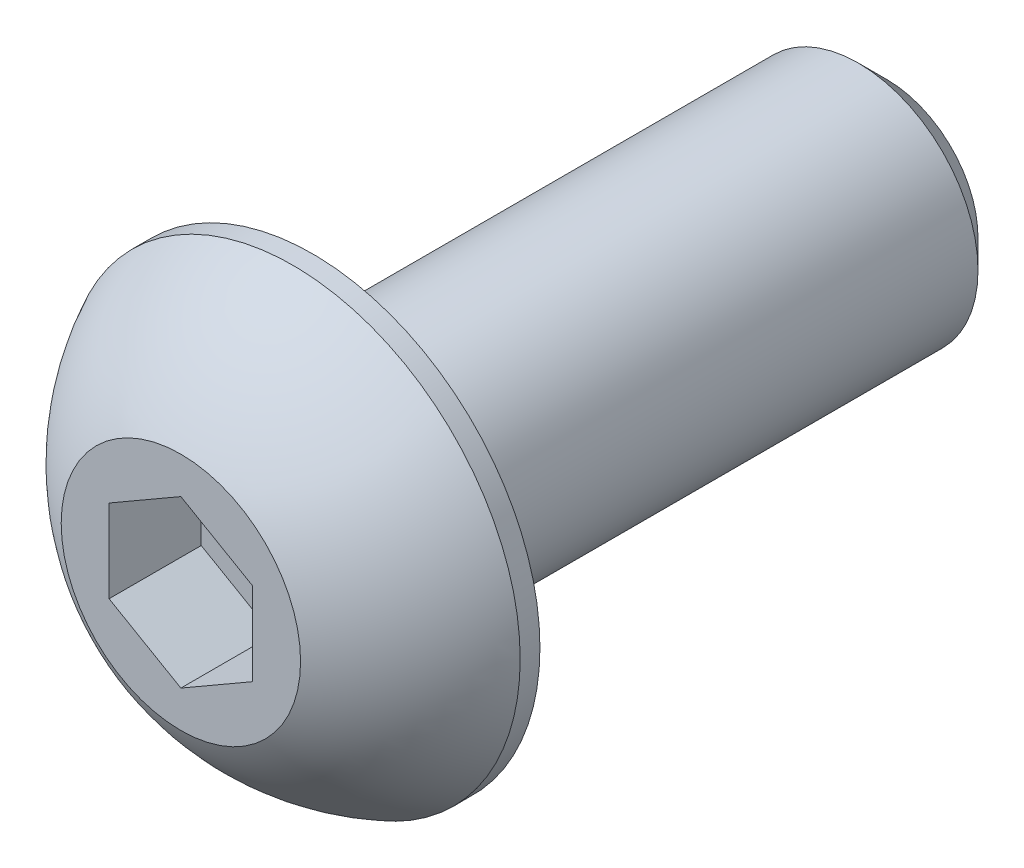
ISO-10303-21;
HEADER;
FILE_DESCRIPTION(('STEP AP214'),'2;1');
FILE_NAME('part.step','',(''),(''),'','','');
FILE_SCHEMA(('AUTOMOTIVE_DESIGN { 1 0 10303 214 1 1 1 1 }'));
ENDSEC;
DATA;
#1=APPLICATION_CONTEXT('core data for automotive mechanical design processes');
#2=APPLICATION_PROTOCOL_DEFINITION('international standard','automotive_design',2000,#1);
#3=PRODUCT_CONTEXT('',#1,'mechanical');
#4=PRODUCT('Part','Part','',(#3));
#5=PRODUCT_RELATED_PRODUCT_CATEGORY('part','',(#4));
#6=PRODUCT_DEFINITION_FORMATION('','',#4);
#7=PRODUCT_DEFINITION_CONTEXT('part definition',#1,'design');
#8=PRODUCT_DEFINITION('design','',#6,#7);
#9=PRODUCT_DEFINITION_SHAPE('','',#8);
#10=(LENGTH_UNIT() NAMED_UNIT(*) SI_UNIT(.MILLI.,.METRE.));
#11=(NAMED_UNIT(*) PLANE_ANGLE_UNIT() SI_UNIT($,.RADIAN.));
#12=(NAMED_UNIT(*) SI_UNIT($,.STERADIAN.) SOLID_ANGLE_UNIT());
#13=UNCERTAINTY_MEASURE_WITH_UNIT(LENGTH_MEASURE(1.E-05),#10,'distance_accuracy_value','');
#14=(GEOMETRIC_REPRESENTATION_CONTEXT(3) GLOBAL_UNCERTAINTY_ASSIGNED_CONTEXT((#13)) GLOBAL_UNIT_ASSIGNED_CONTEXT((#10,
#11,#12)) REPRESENTATION_CONTEXT('',''));
#15=CARTESIAN_POINT('',(0.,0.,0.));
#16=DIRECTION('',(0.,0.,1.));
#17=DIRECTION('',(1.,0.,0.));
#18=AXIS2_PLACEMENT_3D('',#15,#16,#17);
#19=CARTESIAN_POINT('',(0.,-2.5,-14.75));
#20=DIRECTION('',(0.,0.,-1.));
#21=DIRECTION('',(0.,1.,0.));
#22=AXIS2_PLACEMENT_3D('',#19,#20,#21);
#23=PLANE('',#22);
#24=CARTESIAN_POINT('',(0.,0.,-14.75));
#25=DIRECTION('',(0.,0.,-1.));
#26=DIRECTION('',(0.,1.,0.));
#27=AXIS2_PLACEMENT_3D('',#24,#25,#26);
#28=CIRCLE('',#27,1.9);
#29=CARTESIAN_POINT('',(0.,1.9,-14.75));
#30=VERTEX_POINT('',#29);
#31=EDGE_CURVE('E50',#30,#30,#28,.T.);
#32=ORIENTED_EDGE('',*,*,#31,.T.);
#33=EDGE_LOOP('',(#32));
#34=FACE_BOUND('',#33,.T.);
#35=ADVANCED_FACE('F41',(#34),#23,.T.);
#36=CARTESIAN_POINT('',(0.,0.,-14.75));
#37=DIRECTION('',(0.,0.,-1.));
#38=DIRECTION('',(0.,1.,0.));
#39=AXIS2_PLACEMENT_3D('',#36,#37,#38);
#40=CYLINDRICAL_SURFACE('',#39,2.5);
#41=CARTESIAN_POINT('',(0.,0.,-14.15));
#42=DIRECTION('',(0.,0.,-1.));
#43=DIRECTION('',(0.,1.,0.));
#44=AXIS2_PLACEMENT_3D('',#41,#42,#43);
#45=CIRCLE('',#44,2.5);
#46=CARTESIAN_POINT('',(0.,2.5,-14.15));
#47=VERTEX_POINT('',#46);
#48=EDGE_CURVE('E11',#47,#47,#45,.F.);
#49=ORIENTED_EDGE('',*,*,#48,.T.);
#50=EDGE_LOOP('',(#49));
#51=FACE_BOUND('',#50,.T.);
#52=CARTESIAN_POINT('',(0.,0.,-2.75));
#53=DIRECTION('',(0.,0.,1.));
#54=DIRECTION('',(1.,0.,0.));
#55=AXIS2_PLACEMENT_3D('',#52,#53,#54);
#56=CIRCLE('',#55,2.5);
#57=CARTESIAN_POINT('',(2.5,0.,-2.75));
#58=VERTEX_POINT('',#57);
#59=EDGE_CURVE('E177',#58,#58,#56,.F.);
#60=ORIENTED_EDGE('',*,*,#59,.T.);
#61=EDGE_LOOP('',(#60));
#62=FACE_BOUND('',#61,.T.);
#63=ADVANCED_FACE('F187',(#51,#62),#40,.T.);
#64=CARTESIAN_POINT('',(0.,0.,-14.75));
#65=DIRECTION('',(0.,0.,1.));
#66=DIRECTION('',(0.,-1.,0.));
#67=AXIS2_PLACEMENT_3D('',#64,#65,#66);
#68=CONICAL_SURFACE('',#67,1.9,0.785398163397448);
#69=ORIENTED_EDGE('',*,*,#48,.F.);
#70=EDGE_LOOP('',(#69));
#71=FACE_BOUND('',#70,.T.);
#72=ORIENTED_EDGE('',*,*,#31,.F.);
#73=EDGE_LOOP('',(#72));
#74=FACE_BOUND('',#73,.T.);
#75=ADVANCED_FACE('F43',(#71,#74),#68,.T.);
#76=CARTESIAN_POINT('',(0.,0.,-4.65805481283422));
#77=DIRECTION('',(0.,0.,1.));
#78=DIRECTION('',(0.,-1.,0.));
#79=AXIS2_PLACEMENT_3D('',#76,#77,#78);
#80=SPHERICAL_SURFACE('',#79,5.28653711226622);
#81=CARTESIAN_POINT('',(0.,0.,0.));
#82=DIRECTION('',(0.,0.,1.));
#83=DIRECTION('',(1.,0.,0.));
#84=AXIS2_PLACEMENT_3D('',#81,#82,#83);
#85=CIRCLE('',#84,2.5);
#86=CARTESIAN_POINT('',(0.,-2.5,0.));
#87=VERTEX_POINT('',#86);
#88=EDGE_CURVE('E173',#87,#87,#85,.T.);
#89=CARTESIAN_POINT('',(0.,0.,-2.3375));
#90=DIRECTION('',(0.,0.,1.));
#91=DIRECTION('',(1.,0.,0.));
#92=AXIS2_PLACEMENT_3D('',#89,#90,#91);
#93=CIRCLE('',#92,4.75);
#94=CARTESIAN_POINT('',(0.,-4.75,-2.3375));
#95=VERTEX_POINT('',#94);
#96=EDGE_CURVE('E156',#95,#95,#93,.T.);
#97=CARTESIAN_POINT('',(0.,-2.5,0.));
#98=CARTESIAN_POINT('',(0.,-2.53026679982017,-0.016244282455609));
#99=CARTESIAN_POINT('',(0.,-2.56037522904968,-0.0327836412064128));
#100=CARTESIAN_POINT('',(0.,-2.62026400427657,-0.0664460518821871));
#101=CARTESIAN_POINT('',(0.,-2.65004435027396,-0.0835691038071575));
#102=CARTESIAN_POINT('',(0.,-2.70926561698584,-0.11839244141504));
#103=CARTESIAN_POINT('',(0.,-2.73870653770032,-0.136092727097952));
#104=CARTESIAN_POINT('',(0.,-2.79723777417103,-0.172063794044945));
#105=CARTESIAN_POINT('',(0.,-2.82632808992726,-0.190334575309027));
#106=CARTESIAN_POINT('',(0.,-2.8841470610759,-0.227439694392676));
#107=CARTESIAN_POINT('',(0.,-2.91287571646831,-0.246274032212244));
#108=CARTESIAN_POINT('',(0.,-2.96996045130294,-0.284499106978588));
#109=CARTESIAN_POINT('',(0.,-2.99831653074515,-0.303889843925365));
#110=CARTESIAN_POINT('',(0.,-3.05464533901892,-0.343220349244854));
#111=CARTESIAN_POINT('',(0.,-3.08261806785047,-0.363160117617566));
#112=CARTESIAN_POINT('',(0.,-3.13816954607727,-0.403581109164589));
#113=CARTESIAN_POINT('',(0.,-3.16574829547251,-0.424062332338901));
#114=CARTESIAN_POINT('',(0.,-3.22050133565615,-0.465558451209038));
#115=CARTESIAN_POINT('',(0.,-3.24767562644455,-0.486573346904865));
#116=CARTESIAN_POINT('',(0.,-3.30160942393942,-0.529128825735185));
#117=CARTESIAN_POINT('',(0.,-3.32836893064589,-0.550669408869678));
#118=CARTESIAN_POINT('',(0.,-3.38146299210494,-0.594268077753708));
#119=CARTESIAN_POINT('',(0.,-3.40779754685753,-0.616326163503246));
#120=CARTESIAN_POINT('',(0.,-3.46003169800773,-0.660951456155511));
#121=CARTESIAN_POINT('',(0.,-3.48593129440535,-0.683518663058237));
#122=CARTESIAN_POINT('',(0.,-3.53728568771641,-0.729153623103509));
#123=CARTESIAN_POINT('',(0.,-3.56274048462986,-0.752221376246055));
#124=CARTESIAN_POINT('',(0.,-3.61319560685493,-0.798848663663778));
#125=CARTESIAN_POINT('',(0.,-3.63819593216655,-0.822408197938956));
#126=CARTESIAN_POINT('',(0.,-3.68773261175691,-0.870010095651582));
#127=CARTESIAN_POINT('',(0.,-3.71226896603565,-0.89405245908903));
#128=CARTESIAN_POINT('',(0.,-3.76086838042534,-0.942610879694118));
#129=CARTESIAN_POINT('',(0.,-3.78493144053629,-0.967126936861757));
#130=CARTESIAN_POINT('',(0.,-3.83257512329416,-1.01662342950466));
#131=CARTESIAN_POINT('',(0.,-3.85615574594108,-1.04160386497992));
#132=CARTESIAN_POINT('',(0.,-3.90282559378753,-1.0920196223646));
#133=CARTESIAN_POINT('',(0.,-3.92591481898706,-1.11745494427402));
#134=CARTESIAN_POINT('',(0.,-3.97159309867276,-1.1687708098093));
#135=CARTESIAN_POINT('',(0.,-3.99418215315894,-1.19465135343517));
#136=CARTESIAN_POINT('',(0.,-4.03885150820303,-1.24684782851373));
#137=CARTESIAN_POINT('',(0.,-4.06093180876094,-1.27316375996643));
#138=CARTESIAN_POINT('',(0.,-4.10457526604591,-1.32622101137371));
#139=CARTESIAN_POINT('',(0.,-4.12613842277298,-1.3529623313283));
#140=CARTESIAN_POINT('',(0.,-4.16873939899418,-1.40686019877854));
#141=CARTESIAN_POINT('',(0.,-4.1897772184883,-1.4340167462742));
#142=CARTESIAN_POINT('',(0.,-4.23131952645464,-1.488734750071));
#143=CARTESIAN_POINT('',(0.,-4.25182401492686,-1.51629620637214));
#144=CARTESIAN_POINT('',(0.,-4.29229186971308,-1.5718135551894));
#145=CARTESIAN_POINT('',(0.,-4.31225523602708,-1.59976944770551));
#146=CARTESIAN_POINT('',(0.,-4.35163326096594,-1.65606504649041));
#147=CARTESIAN_POINT('',(0.,-4.3710479195908,-1.6844047527592));
#148=CARTESIAN_POINT('',(0.,-4.40932115213664,-1.74145721073709));
#149=CARTESIAN_POINT('',(0.,-4.42817972605763,-1.77016996244618));
#150=CARTESIAN_POINT('',(0.,-4.46533362339398,-1.82795760128832));
#151=CARTESIAN_POINT('',(0.,-4.48362894680934,-1.85703248842136));
#152=CARTESIAN_POINT('',(0.,-4.51964939166499,-1.91553335033324));
#153=CARTESIAN_POINT('',(0.,-4.53737451310527,-1.94495932511208));
#154=CARTESIAN_POINT('',(0.,-4.57224781803529,-2.00415118173237));
#155=CARTESIAN_POINT('',(0.,-4.58939600152503,-2.03391706357382));
#156=CARTESIAN_POINT('',(0.,-4.62310891815402,-2.09377742234707));
#157=CARTESIAN_POINT('',(0.,-4.63967365129327,-2.12387189927887));
#158=CARTESIAN_POINT('',(0.,-4.67221336026297,-2.18437801974018));
#159=CARTESIAN_POINT('',(0.,-4.68818833609342,-2.21478966326969));
#160=CARTESIAN_POINT('',(0.,-4.71954250823692,-2.27591853680649));
#161=CARTESIAN_POINT('',(0.,-4.73492170454996,-2.30663576681378));
#162=CARTESIAN_POINT('',(0.,-4.75,-2.3375));
#163=B_SPLINE_CURVE_WITH_KNOTS('',3,(#97,#98,#99,#100,#101,#102,#103,#104,#105,#106,#107,#108,
#109,#110,#111,#112,#113,#114,#115,#116,#117,#118,#119,#120,#121,#122,#123,#124,#125,#126,#127,
#128,#129,#130,#131,#132,#133,#134,#135,#136,#137,#138,#139,#140,#141,#142,#143,#144,#145,#146,
#147,#148,#149,#150,#151,#152,#153,#154,#155,#156,#157,#158,#159,#160,#161,#162),.UNSPECIFIED.,
.F.,.F.,(4,2,2,2,2,2,2,2,2,2,2,2,2,2,2,2,2,2,2,2,2,2,2,2,2,2,2,2,2,2,2,2,4),(0.,
0.10304982363783,0.206099647275662,0.309149470913491,0.412199294551322,0.515249118189152,
0.618298941826983,0.721348765464812,0.824398589102643,0.927448412740473,1.0304982363783,
1.13354806001613,1.23659788365396,1.33964770729179,1.44269753092962,1.54574735456745,
1.64879717820529,1.75184700184312,1.85489682548095,1.95794664911878,2.06099647275661,
2.16404629639444,2.26709612003227,2.3701459436701,2.47319576730793,2.57624559094576,
2.67929541458359,2.78234523822142,2.88539506185925,2.98844488549708,3.09149470913491,
3.19454453277274,3.29759435641057),.UNSPECIFIED.);
#164=EDGE_CURVE('BSEAM186',#87,#95,#163,.T.);
#165=ORIENTED_EDGE('',*,*,#88,.F.);
#166=ORIENTED_EDGE('',*,*,#96,.T.);
#167=ORIENTED_EDGE('',*,*,#164,.T.);
#168=ORIENTED_EDGE('',*,*,#164,.F.);
#169=EDGE_LOOP('',(#165,#167,#166,#168));
#170=FACE_BOUND('',#169,.T.);
#171=ADVANCED_FACE('F186',(#170),#80,.T.);
#172=CARTESIAN_POINT('',(0.,-2.5,0.));
#173=DIRECTION('',(0.,0.,-1.));
#174=DIRECTION('',(-1.,0.,0.));
#175=AXIS2_PLACEMENT_3D('',#172,#173,#174);
#176=PLANE('',#175);
#177=DIRECTION('',(0.,1.,0.));
#178=VECTOR('',#177,1.);
#179=CARTESIAN_POINT('',(1.5,-0.866025403784438,0.));
#180=LINE('',#179,#178);
#181=CARTESIAN_POINT('',(1.5,-0.866025403784439,0.));
#182=VERTEX_POINT('',#181);
#183=CARTESIAN_POINT('',(1.5,0.866025403784439,0.));
#184=VERTEX_POINT('',#183);
#185=EDGE_CURVE('E137',#182,#184,#180,.T.);
#186=ORIENTED_EDGE('',*,*,#185,.F.);
#187=DIRECTION('',(0.866025403784438,0.5,0.));
#188=VECTOR('',#187,1.);
#189=CARTESIAN_POINT('',(0.,-1.73205080756888,0.));
#190=LINE('',#189,#188);
#191=CARTESIAN_POINT('',(0.,-1.73205080756888,0.));
#192=VERTEX_POINT('',#191);
#193=EDGE_CURVE('E57',#192,#182,#190,.T.);
#194=ORIENTED_EDGE('',*,*,#193,.F.);
#195=DIRECTION('',(0.866025403784439,-0.5,0.));
#196=VECTOR('',#195,1.);
#197=CARTESIAN_POINT('',(-1.5,-0.866025403784439,0.));
#198=LINE('',#197,#196);
#199=CARTESIAN_POINT('',(-1.5,-0.866025403784439,0.));
#200=VERTEX_POINT('',#199);
#201=EDGE_CURVE('E150',#200,#192,#198,.T.);
#202=ORIENTED_EDGE('',*,*,#201,.F.);
#203=DIRECTION('',(0.,-1.,0.));
#204=VECTOR('',#203,1.);
#205=CARTESIAN_POINT('',(-1.5,0.866025403784438,0.));
#206=LINE('',#205,#204);
#207=CARTESIAN_POINT('',(-1.5,0.866025403784438,0.));
#208=VERTEX_POINT('',#207);
#209=EDGE_CURVE('E147',#208,#200,#206,.T.);
#210=ORIENTED_EDGE('',*,*,#209,.F.);
#211=DIRECTION('',(-0.866025403784438,-0.5,0.));
#212=VECTOR('',#211,1.);
#213=CARTESIAN_POINT('',(0.,1.73205080756888,0.));
#214=LINE('',#213,#212);
#215=CARTESIAN_POINT('',(0.,1.73205080756888,0.));
#216=VERTEX_POINT('',#215);
#217=EDGE_CURVE('E105',#216,#208,#214,.T.);
#218=ORIENTED_EDGE('',*,*,#217,.F.);
#219=DIRECTION('',(-0.866025403784439,0.5,0.));
#220=VECTOR('',#219,1.);
#221=CARTESIAN_POINT('',(1.5,0.866025403784439,0.));
#222=LINE('',#221,#220);
#223=EDGE_CURVE('E141',#184,#216,#222,.T.);
#224=ORIENTED_EDGE('',*,*,#223,.F.);
#225=EDGE_LOOP('',(#186,#194,#202,#210,#218,#224));
#226=FACE_BOUND('',#225,.T.);
#227=ORIENTED_EDGE('',*,*,#88,.T.);
#228=EDGE_LOOP('',(#227));
#229=FACE_BOUND('',#228,.T.);
#230=ADVANCED_FACE('F193',(#226,#229),#176,.F.);
#231=CARTESIAN_POINT('',(0.,-4.75,-2.75));
#232=DIRECTION('',(0.,0.,1.));
#233=DIRECTION('',(1.,0.,0.));
#234=AXIS2_PLACEMENT_3D('',#231,#232,#233);
#235=PLANE('',#234);
#236=ORIENTED_EDGE('',*,*,#59,.F.);
#237=EDGE_LOOP('',(#236));
#238=FACE_BOUND('',#237,.T.);
#239=CARTESIAN_POINT('',(0.,0.,-2.75));
#240=DIRECTION('',(0.,0.,1.));
#241=DIRECTION('',(1.,0.,0.));
#242=AXIS2_PLACEMENT_3D('',#239,#240,#241);
#243=CIRCLE('',#242,4.75);
#244=CARTESIAN_POINT('',(4.75,0.,-2.75));
#245=VERTEX_POINT('',#244);
#246=EDGE_CURVE('E169',#245,#245,#243,.T.);
#247=ORIENTED_EDGE('',*,*,#246,.F.);
#248=EDGE_LOOP('',(#247));
#249=FACE_BOUND('',#248,.T.);
#250=ADVANCED_FACE('F205',(#238,#249),#235,.F.);
#251=CARTESIAN_POINT('',(0.,0.,0.));
#252=DIRECTION('',(0.,0.,1.));
#253=DIRECTION('',(1.,0.,0.));
#254=AXIS2_PLACEMENT_3D('',#251,#252,#253);
#255=CYLINDRICAL_SURFACE('',#254,4.75);
#256=ORIENTED_EDGE('',*,*,#96,.F.);
#257=EDGE_LOOP('',(#256));
#258=FACE_BOUND('',#257,.T.);
#259=ORIENTED_EDGE('',*,*,#246,.T.);
#260=EDGE_LOOP('',(#259));
#261=FACE_BOUND('',#260,.T.);
#262=ADVANCED_FACE('F209',(#258,#261),#255,.T.);
#263=CARTESIAN_POINT('',(0.,-1.73205080756888,-1.925));
#264=DIRECTION('',(0.5,-0.866025403784438,0.));
#265=DIRECTION('',(0.866025403784438,0.5,0.));
#266=AXIS2_PLACEMENT_3D('',#263,#264,#265);
#267=PLANE('',#266);
#268=ORIENTED_EDGE('',*,*,#193,.T.);
#269=DIRECTION('',(0.,0.,1.));
#270=VECTOR('',#269,1.);
#271=CARTESIAN_POINT('',(1.5,-0.866025403784438,-1.925));
#272=LINE('',#271,#270);
#273=CARTESIAN_POINT('',(1.5,-0.866025403784438,-1.925));
#274=VERTEX_POINT('',#273);
#275=EDGE_CURVE('E87',#274,#182,#272,.T.);
#276=ORIENTED_EDGE('',*,*,#275,.F.);
#277=DIRECTION('',(0.866025403784438,0.5,0.));
#278=VECTOR('',#277,1.);
#279=CARTESIAN_POINT('',(0.,-1.73205080756888,-1.925));
#280=LINE('',#279,#278);
#281=CARTESIAN_POINT('',(0.,-1.73205080756888,-1.925));
#282=VERTEX_POINT('',#281);
#283=EDGE_CURVE('E153',#282,#274,#280,.T.);
#284=ORIENTED_EDGE('',*,*,#283,.F.);
#285=DIRECTION('',(0.,0.,1.));
#286=VECTOR('',#285,1.);
#287=CARTESIAN_POINT('',(0.,-1.73205080756888,-1.925));
#288=LINE('',#287,#286);
#289=EDGE_CURVE('E65',#282,#192,#288,.T.);
#290=ORIENTED_EDGE('',*,*,#289,.T.);
#291=EDGE_LOOP('',(#268,#276,#284,#290));
#292=FACE_BOUND('',#291,.T.);
#293=ADVANCED_FACE('F213',(#292),#267,.F.);
#294=CARTESIAN_POINT('',(-1.5,-0.866025403784439,-1.925));
#295=DIRECTION('',(-0.5,-0.866025403784439,0.));
#296=DIRECTION('',(0.866025403784439,-0.5,0.));
#297=AXIS2_PLACEMENT_3D('',#294,#295,#296);
#298=PLANE('',#297);
#299=ORIENTED_EDGE('',*,*,#201,.T.);
#300=ORIENTED_EDGE('',*,*,#289,.F.);
#301=DIRECTION('',(0.866025403784439,-0.5,0.));
#302=VECTOR('',#301,1.);
#303=CARTESIAN_POINT('',(-1.5,-0.866025403784439,-1.925));
#304=LINE('',#303,#302);
#305=CARTESIAN_POINT('',(-1.5,-0.866025403784439,-1.925));
#306=VERTEX_POINT('',#305);
#307=EDGE_CURVE('E119',#306,#282,#304,.T.);
#308=ORIENTED_EDGE('',*,*,#307,.F.);
#309=DIRECTION('',(0.,0.,1.));
#310=VECTOR('',#309,1.);
#311=CARTESIAN_POINT('',(-1.5,-0.866025403784439,-1.925));
#312=LINE('',#311,#310);
#313=EDGE_CURVE('E110',#306,#200,#312,.T.);
#314=ORIENTED_EDGE('',*,*,#313,.T.);
#315=EDGE_LOOP('',(#299,#300,#308,#314));
#316=FACE_BOUND('',#315,.T.);
#317=ADVANCED_FACE('F217',(#316),#298,.F.);
#318=CARTESIAN_POINT('',(-1.5,0.866025403784438,-1.925));
#319=DIRECTION('',(-1.,0.,0.));
#320=DIRECTION('',(0.,0.,1.));
#321=AXIS2_PLACEMENT_3D('',#318,#319,#320);
#322=PLANE('',#321);
#323=ORIENTED_EDGE('',*,*,#209,.T.);
#324=ORIENTED_EDGE('',*,*,#313,.F.);
#325=DIRECTION('',(0.,-1.,0.));
#326=VECTOR('',#325,1.);
#327=CARTESIAN_POINT('',(-1.5,0.866025403784438,-1.925));
#328=LINE('',#327,#326);
#329=CARTESIAN_POINT('',(-1.5,0.866025403784438,-1.925));
#330=VERTEX_POINT('',#329);
#331=EDGE_CURVE('E114',#330,#306,#328,.T.);
#332=ORIENTED_EDGE('',*,*,#331,.F.);
#333=DIRECTION('',(0.,0.,1.));
#334=VECTOR('',#333,1.);
#335=CARTESIAN_POINT('',(-1.5,0.866025403784438,-1.925));
#336=LINE('',#335,#334);
#337=EDGE_CURVE('E98',#330,#208,#336,.T.);
#338=ORIENTED_EDGE('',*,*,#337,.T.);
#339=EDGE_LOOP('',(#323,#324,#332,#338));
#340=FACE_BOUND('',#339,.T.);
#341=ADVANCED_FACE('F115',(#340),#322,.F.);
#342=CARTESIAN_POINT('',(0.,1.73205080756888,-1.925));
#343=DIRECTION('',(-0.5,0.866025403784438,0.));
#344=DIRECTION('',(-0.866025403784438,-0.5,0.));
#345=AXIS2_PLACEMENT_3D('',#342,#343,#344);
#346=PLANE('',#345);
#347=ORIENTED_EDGE('',*,*,#217,.T.);
#348=ORIENTED_EDGE('',*,*,#337,.F.);
#349=DIRECTION('',(-0.866025403784438,-0.5,0.));
#350=VECTOR('',#349,1.);
#351=CARTESIAN_POINT('',(0.,1.73205080756888,-1.925));
#352=LINE('',#351,#350);
#353=CARTESIAN_POINT('',(0.,1.73205080756888,-1.925));
#354=VERTEX_POINT('',#353);
#355=EDGE_CURVE('E102',#354,#330,#352,.T.);
#356=ORIENTED_EDGE('',*,*,#355,.F.);
#357=DIRECTION('',(0.,0.,1.));
#358=VECTOR('',#357,1.);
#359=CARTESIAN_POINT('',(0.,1.73205080756888,-1.925));
#360=LINE('',#359,#358);
#361=EDGE_CURVE('E111',#354,#216,#360,.T.);
#362=ORIENTED_EDGE('',*,*,#361,.T.);
#363=EDGE_LOOP('',(#347,#348,#356,#362));
#364=FACE_BOUND('',#363,.T.);
#365=ADVANCED_FACE('F100',(#364),#346,.F.);
#366=CARTESIAN_POINT('',(1.5,0.866025403784439,-1.925));
#367=DIRECTION('',(0.5,0.866025403784439,0.));
#368=DIRECTION('',(-0.866025403784439,0.5,0.));
#369=AXIS2_PLACEMENT_3D('',#366,#367,#368);
#370=PLANE('',#369);
#371=ORIENTED_EDGE('',*,*,#223,.T.);
#372=ORIENTED_EDGE('',*,*,#361,.F.);
#373=DIRECTION('',(-0.866025403784439,0.5,0.));
#374=VECTOR('',#373,1.);
#375=CARTESIAN_POINT('',(1.5,0.866025403784439,-1.925));
#376=LINE('',#375,#374);
#377=CARTESIAN_POINT('',(1.5,0.866025403784439,-1.925));
#378=VERTEX_POINT('',#377);
#379=EDGE_CURVE('E125',#378,#354,#376,.T.);
#380=ORIENTED_EDGE('',*,*,#379,.F.);
#381=DIRECTION('',(0.,0.,1.));
#382=VECTOR('',#381,1.);
#383=CARTESIAN_POINT('',(1.5,0.866025403784439,-1.925));
#384=LINE('',#383,#382);
#385=EDGE_CURVE('E161',#378,#184,#384,.T.);
#386=ORIENTED_EDGE('',*,*,#385,.T.);
#387=EDGE_LOOP('',(#371,#372,#380,#386));
#388=FACE_BOUND('',#387,.T.);
#389=ADVANCED_FACE('F221',(#388),#370,.F.);
#390=CARTESIAN_POINT('',(1.5,-0.866025403784438,-1.925));
#391=DIRECTION('',(1.,0.,0.));
#392=DIRECTION('',(0.,0.,-1.));
#393=AXIS2_PLACEMENT_3D('',#390,#391,#392);
#394=PLANE('',#393);
#395=ORIENTED_EDGE('',*,*,#185,.T.);
#396=ORIENTED_EDGE('',*,*,#385,.F.);
#397=DIRECTION('',(0.,1.,0.));
#398=VECTOR('',#397,1.);
#399=CARTESIAN_POINT('',(1.5,-0.866025403784438,-1.925));
#400=LINE('',#399,#398);
#401=EDGE_CURVE('E129',#274,#378,#400,.T.);
#402=ORIENTED_EDGE('',*,*,#401,.F.);
#403=ORIENTED_EDGE('',*,*,#275,.T.);
#404=EDGE_LOOP('',(#395,#396,#402,#403));
#405=FACE_BOUND('',#404,.T.);
#406=ADVANCED_FACE('F218',(#405),#394,.F.);
#407=CARTESIAN_POINT('',(1.5,-0.866025403784438,-1.925));
#408=DIRECTION('',(0.,0.,1.));
#409=DIRECTION('',(1.,0.,0.));
#410=AXIS2_PLACEMENT_3D('',#407,#408,#409);
#411=PLANE('',#410);
#412=ORIENTED_EDGE('',*,*,#283,.T.);
#413=ORIENTED_EDGE('',*,*,#401,.T.);
#414=ORIENTED_EDGE('',*,*,#379,.T.);
#415=ORIENTED_EDGE('',*,*,#355,.T.);
#416=ORIENTED_EDGE('',*,*,#331,.T.);
#417=ORIENTED_EDGE('',*,*,#307,.T.);
#418=EDGE_LOOP('',(#412,#413,#414,#415,#416,#417));
#419=FACE_BOUND('',#418,.T.);
#420=ADVANCED_FACE('F122',(#419),#411,.T.);
#421=CLOSED_SHELL('',(#35,#63,#75,#171,#230,#250,#262,#293,#317,#341,#365,#389,#406,#420));
#422=MANIFOLD_SOLID_BREP('B2',#421);
#423=ADVANCED_BREP_SHAPE_REPRESENTATION('',(#18,#422),#14);
#424=SHAPE_DEFINITION_REPRESENTATION(#9,#423);
ENDSEC;
END-ISO-10303-21;
